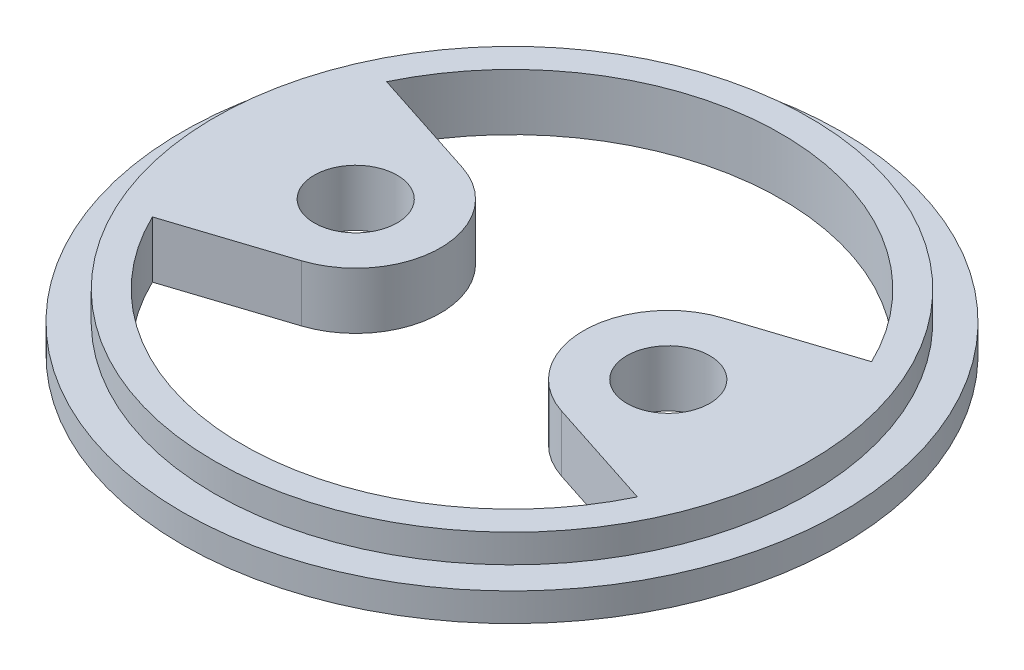
ISO-10303-21;
HEADER;
FILE_DESCRIPTION(('STEP AP214'),'2;1');
FILE_NAME('part.step','',(''),(''),'','','');
FILE_SCHEMA(('AUTOMOTIVE_DESIGN { 1 0 10303 214 1 1 1 1 }'));
ENDSEC;
DATA;
#1=APPLICATION_CONTEXT('core data for automotive mechanical design processes');
#2=APPLICATION_PROTOCOL_DEFINITION('international standard','automotive_design',2000,#1);
#3=PRODUCT_CONTEXT('',#1,'mechanical');
#4=PRODUCT('Part','Part','',(#3));
#5=PRODUCT_RELATED_PRODUCT_CATEGORY('part','',(#4));
#6=PRODUCT_DEFINITION_FORMATION('','',#4);
#7=PRODUCT_DEFINITION_CONTEXT('part definition',#1,'design');
#8=PRODUCT_DEFINITION('design','',#6,#7);
#9=PRODUCT_DEFINITION_SHAPE('','',#8);
#10=(LENGTH_UNIT() NAMED_UNIT(*) SI_UNIT(.MILLI.,.METRE.));
#11=(NAMED_UNIT(*) PLANE_ANGLE_UNIT() SI_UNIT($,.RADIAN.));
#12=(NAMED_UNIT(*) SI_UNIT($,.STERADIAN.) SOLID_ANGLE_UNIT());
#13=UNCERTAINTY_MEASURE_WITH_UNIT(LENGTH_MEASURE(1.E-05),#10,'distance_accuracy_value','');
#14=(GEOMETRIC_REPRESENTATION_CONTEXT(3) GLOBAL_UNCERTAINTY_ASSIGNED_CONTEXT((#13)) GLOBAL_UNIT_ASSIGNED_CONTEXT((#10,
#11,#12)) REPRESENTATION_CONTEXT('',''));
#15=CARTESIAN_POINT('',(0.,0.,0.));
#16=DIRECTION('',(0.,0.,1.));
#17=DIRECTION('',(1.,0.,0.));
#18=AXIS2_PLACEMENT_3D('',#15,#16,#17);
#19=CARTESIAN_POINT('',(0.,3.,0.));
#20=DIRECTION('',(0.,1.,0.));
#21=DIRECTION('',(0.,0.,1.));
#22=AXIS2_PLACEMENT_3D('',#19,#20,#21);
#23=PLANE('',#22);
#24=CARTESIAN_POINT('',(-8.3,3.,0.));
#25=DIRECTION('',(0.,1.,0.));
#26=DIRECTION('',(0.,0.,1.));
#27=AXIS2_PLACEMENT_3D('',#24,#25,#26);
#28=CIRCLE('',#27,2.2);
#29=CARTESIAN_POINT('',(-8.3,3.,2.2));
#30=VERTEX_POINT('',#29);
#31=EDGE_CURVE('E57',#30,#30,#28,.T.);
#32=ORIENTED_EDGE('',*,*,#31,.F.);
#33=EDGE_LOOP('',(#32));
#34=FACE_BOUND('',#33,.T.);
#35=CARTESIAN_POINT('',(8.3,3.,0.));
#36=DIRECTION('',(0.,-1.,0.));
#37=DIRECTION('',(0.,0.,-1.));
#38=AXIS2_PLACEMENT_3D('',#35,#36,#37);
#39=CIRCLE('',#38,2.2);
#40=CARTESIAN_POINT('',(8.3,3.,-2.2));
#41=VERTEX_POINT('',#40);
#42=EDGE_CURVE('E184',#41,#41,#39,.T.);
#43=ORIENTED_EDGE('',*,*,#42,.T.);
#44=EDGE_LOOP('',(#43));
#45=FACE_BOUND('',#44,.T.);
#46=CARTESIAN_POINT('',(0.,3.,0.));
#47=DIRECTION('',(0.,1.,0.));
#48=DIRECTION('',(0.,0.,1.));
#49=AXIS2_PLACEMENT_3D('',#46,#47,#48);
#50=CIRCLE('',#49,15.8);
#51=CARTESIAN_POINT('',(0.,3.,15.8));
#52=VERTEX_POINT('',#51);
#53=EDGE_CURVE('E167',#52,#52,#50,.T.);
#54=ORIENTED_EDGE('',*,*,#53,.T.);
#55=EDGE_LOOP('',(#54));
#56=FACE_BOUND('',#55,.T.);
#57=DIRECTION('',(0.951056516295155,0.,-0.309016994374942));
#58=VECTOR('',#57,1.);
#59=CARTESIAN_POINT('',(-0.597997001343299,3.,-1.84044552631447));
#60=LINE('',#59,#58);
#61=CARTESIAN_POINT('',(6.90942352531276,3.,-4.2797543233282));
#62=VERTEX_POINT('',#61);
#63=CARTESIAN_POINT('',(12.8770058875075,3.,-6.21873937169731));
#64=VERTEX_POINT('',#63);
#65=EDGE_CURVE('E151',#62,#64,#60,.T.);
#66=ORIENTED_EDGE('',*,*,#65,.F.);
#67=CARTESIAN_POINT('',(8.3,3.,0.));
#68=DIRECTION('',(0.,1.,0.));
#69=DIRECTION('',(0.,0.,1.));
#70=AXIS2_PLACEMENT_3D('',#67,#68,#69);
#71=CIRCLE('',#70,4.5);
#72=CARTESIAN_POINT('',(6.90942352531276,3.,4.2797543233282));
#73=VERTEX_POINT('',#72);
#74=EDGE_CURVE('E64',#62,#73,#71,.T.);
#75=ORIENTED_EDGE('',*,*,#74,.T.);
#76=DIRECTION('',(0.951056516295155,0.,0.309016994374942));
#77=VECTOR('',#76,1.);
#78=CARTESIAN_POINT('',(-0.597997001343299,3.,1.84044552631447));
#79=LINE('',#78,#77);
#80=CARTESIAN_POINT('',(12.8770058875075,3.,6.21873937169731));
#81=VERTEX_POINT('',#80);
#82=EDGE_CURVE('E133',#73,#81,#79,.T.);
#83=ORIENTED_EDGE('',*,*,#82,.T.);
#84=CARTESIAN_POINT('',(0.,3.,0.));
#85=DIRECTION('',(0.,1.,0.));
#86=DIRECTION('',(0.,0.,1.));
#87=AXIS2_PLACEMENT_3D('',#84,#85,#86);
#88=CIRCLE('',#87,14.3);
#89=CARTESIAN_POINT('',(-12.8770058875075,3.,6.21873937169731));
#90=VERTEX_POINT('',#89);
#91=EDGE_CURVE('E136',#90,#81,#88,.T.);
#92=ORIENTED_EDGE('',*,*,#91,.F.);
#93=DIRECTION('',(-0.951056516295156,0.,0.309016994374942));
#94=VECTOR('',#93,1.);
#95=CARTESIAN_POINT('',(0.597997001343298,3.,1.84044552631448));
#96=LINE('',#95,#94);
#97=CARTESIAN_POINT('',(-6.90942352531276,3.,4.2797543233282));
#98=VERTEX_POINT('',#97);
#99=EDGE_CURVE('E162',#98,#90,#96,.T.);
#100=ORIENTED_EDGE('',*,*,#99,.F.);
#101=CARTESIAN_POINT('',(-8.3,3.,0.));
#102=DIRECTION('',(0.,1.,0.));
#103=DIRECTION('',(0.,0.,1.));
#104=AXIS2_PLACEMENT_3D('',#101,#102,#103);
#105=CIRCLE('',#104,4.5);
#106=CARTESIAN_POINT('',(-6.90942352531276,3.,-4.2797543233282));
#107=VERTEX_POINT('',#106);
#108=EDGE_CURVE('E159',#107,#98,#105,.F.);
#109=ORIENTED_EDGE('',*,*,#108,.F.);
#110=DIRECTION('',(-0.951056516295156,0.,-0.309016994374942));
#111=VECTOR('',#110,1.);
#112=CARTESIAN_POINT('',(0.597997001343298,3.,-1.84044552631448));
#113=LINE('',#112,#111);
#114=CARTESIAN_POINT('',(-12.8770058875075,3.,-6.21873937169731));
#115=VERTEX_POINT('',#114);
#116=EDGE_CURVE('E156',#107,#115,#113,.T.);
#117=ORIENTED_EDGE('',*,*,#116,.T.);
#118=EDGE_CURVE('E153',#64,#115,#88,.T.);
#119=ORIENTED_EDGE('',*,*,#118,.F.);
#120=EDGE_LOOP('',(#66,#75,#83,#92,#100,#109,#117,#119));
#121=FACE_BOUND('',#120,.T.);
#122=ADVANCED_FACE('F48',(#34,#45,#56,#121),#23,.T.);
#123=CARTESIAN_POINT('',(0.,0.,0.));
#124=DIRECTION('',(0.,1.,0.));
#125=DIRECTION('',(0.,0.,1.));
#126=AXIS2_PLACEMENT_3D('',#123,#124,#125);
#127=PLANE('',#126);
#128=CARTESIAN_POINT('',(-8.3,0.,0.));
#129=DIRECTION('',(0.,1.,0.));
#130=DIRECTION('',(0.,0.,1.));
#131=AXIS2_PLACEMENT_3D('',#128,#129,#130);
#132=CIRCLE('',#131,2.2);
#133=CARTESIAN_POINT('',(-8.3,0.,2.2));
#134=VERTEX_POINT('',#133);
#135=EDGE_CURVE('E187',#134,#134,#132,.T.);
#136=ORIENTED_EDGE('',*,*,#135,.T.);
#137=EDGE_LOOP('',(#136));
#138=FACE_BOUND('',#137,.T.);
#139=CARTESIAN_POINT('',(0.,0.,0.));
#140=DIRECTION('',(0.,1.,0.));
#141=DIRECTION('',(0.,0.,1.));
#142=AXIS2_PLACEMENT_3D('',#139,#140,#141);
#143=CIRCLE('',#142,17.5);
#144=CARTESIAN_POINT('',(0.,0.,17.5));
#145=VERTEX_POINT('',#144);
#146=EDGE_CURVE('E13',#145,#145,#143,.T.);
#147=ORIENTED_EDGE('',*,*,#146,.F.);
#148=EDGE_LOOP('',(#147));
#149=FACE_BOUND('',#148,.T.);
#150=CARTESIAN_POINT('',(8.3,0.,0.));
#151=DIRECTION('',(0.,-1.,0.));
#152=DIRECTION('',(0.,0.,-1.));
#153=AXIS2_PLACEMENT_3D('',#150,#151,#152);
#154=CIRCLE('',#153,2.2);
#155=CARTESIAN_POINT('',(8.3,0.,-2.2));
#156=VERTEX_POINT('',#155);
#157=EDGE_CURVE('E188',#156,#156,#154,.T.);
#158=ORIENTED_EDGE('',*,*,#157,.F.);
#159=EDGE_LOOP('',(#158));
#160=FACE_BOUND('',#159,.T.);
#161=CARTESIAN_POINT('',(8.3,0.,0.));
#162=DIRECTION('',(0.,1.,0.));
#163=DIRECTION('',(0.,0.,1.));
#164=AXIS2_PLACEMENT_3D('',#161,#162,#163);
#165=CIRCLE('',#164,4.5);
#166=CARTESIAN_POINT('',(6.90942352531276,0.,-4.2797543233282));
#167=VERTEX_POINT('',#166);
#168=CARTESIAN_POINT('',(6.90942352531276,0.,4.2797543233282));
#169=VERTEX_POINT('',#168);
#170=EDGE_CURVE('E117',#167,#169,#165,.T.);
#171=ORIENTED_EDGE('',*,*,#170,.F.);
#172=DIRECTION('',(0.951056516295155,0.,-0.309016994374942));
#173=VECTOR('',#172,1.);
#174=CARTESIAN_POINT('',(-0.597997001343299,0.,-1.84044552631447));
#175=LINE('',#174,#173);
#176=CARTESIAN_POINT('',(12.8770058875075,0.,-6.21873937169731));
#177=VERTEX_POINT('',#176);
#178=EDGE_CURVE('E126',#167,#177,#175,.T.);
#179=ORIENTED_EDGE('',*,*,#178,.T.);
#180=CARTESIAN_POINT('',(0.,0.,0.));
#181=DIRECTION('',(0.,1.,0.));
#182=DIRECTION('',(0.,0.,1.));
#183=AXIS2_PLACEMENT_3D('',#180,#181,#182);
#184=CIRCLE('',#183,14.3);
#185=CARTESIAN_POINT('',(-12.8770058875075,0.,-6.21873937169731));
#186=VERTEX_POINT('',#185);
#187=EDGE_CURVE('E72',#177,#186,#184,.T.);
#188=ORIENTED_EDGE('',*,*,#187,.T.);
#189=DIRECTION('',(-0.951056516295156,0.,-0.309016994374942));
#190=VECTOR('',#189,1.);
#191=CARTESIAN_POINT('',(0.597997001343298,0.,-1.84044552631448));
#192=LINE('',#191,#190);
#193=CARTESIAN_POINT('',(-6.90942352531276,0.,-4.2797543233282));
#194=VERTEX_POINT('',#193);
#195=EDGE_CURVE('E140',#194,#186,#192,.T.);
#196=ORIENTED_EDGE('',*,*,#195,.F.);
#197=CARTESIAN_POINT('',(-8.3,0.,0.));
#198=DIRECTION('',(0.,1.,0.));
#199=DIRECTION('',(0.,0.,1.));
#200=AXIS2_PLACEMENT_3D('',#197,#198,#199);
#201=CIRCLE('',#200,4.5);
#202=CARTESIAN_POINT('',(-6.90942352531276,0.,4.2797543233282));
#203=VERTEX_POINT('',#202);
#204=EDGE_CURVE('E143',#194,#203,#201,.F.);
#205=ORIENTED_EDGE('',*,*,#204,.T.);
#206=DIRECTION('',(-0.951056516295156,0.,0.309016994374942));
#207=VECTOR('',#206,1.);
#208=CARTESIAN_POINT('',(0.597997001343298,0.,1.84044552631448));
#209=LINE('',#208,#207);
#210=CARTESIAN_POINT('',(-12.8770058875075,0.,6.21873937169731));
#211=VERTEX_POINT('',#210);
#212=EDGE_CURVE('E146',#203,#211,#209,.T.);
#213=ORIENTED_EDGE('',*,*,#212,.T.);
#214=CARTESIAN_POINT('',(12.8770058875075,0.,6.21873937169731));
#215=VERTEX_POINT('',#214);
#216=EDGE_CURVE('E141',#211,#215,#184,.T.);
#217=ORIENTED_EDGE('',*,*,#216,.T.);
#218=DIRECTION('',(0.951056516295155,0.,0.309016994374942));
#219=VECTOR('',#218,1.);
#220=CARTESIAN_POINT('',(-0.597997001343299,0.,1.84044552631447));
#221=LINE('',#220,#219);
#222=EDGE_CURVE('E123',#169,#215,#221,.T.);
#223=ORIENTED_EDGE('',*,*,#222,.F.);
#224=EDGE_LOOP('',(#171,#179,#188,#196,#205,#213,#217,#223));
#225=FACE_BOUND('',#224,.T.);
#226=ADVANCED_FACE('F131',(#138,#149,#160,#225),#127,.F.);
#227=CARTESIAN_POINT('',(0.,3.,0.));
#228=DIRECTION('',(0.,-1.,0.));
#229=DIRECTION('',(0.,0.,-1.));
#230=AXIS2_PLACEMENT_3D('',#227,#228,#229);
#231=CYLINDRICAL_SURFACE('',#230,17.5);
#232=ORIENTED_EDGE('',*,*,#146,.T.);
#233=EDGE_LOOP('',(#232));
#234=FACE_BOUND('',#233,.T.);
#235=CARTESIAN_POINT('',(0.,1.5,0.));
#236=DIRECTION('',(0.,1.,0.));
#237=DIRECTION('',(0.,0.,1.));
#238=AXIS2_PLACEMENT_3D('',#235,#236,#237);
#239=CIRCLE('',#238,17.5);
#240=CARTESIAN_POINT('',(0.,1.5,17.5));
#241=VERTEX_POINT('',#240);
#242=EDGE_CURVE('E52',#241,#241,#239,.T.);
#243=ORIENTED_EDGE('',*,*,#242,.F.);
#244=EDGE_LOOP('',(#243));
#245=FACE_BOUND('',#244,.T.);
#246=ADVANCED_FACE('F50',(#234,#245),#231,.T.);
#247=CARTESIAN_POINT('',(-8.3,3.,0.));
#248=DIRECTION('',(0.,-1.,0.));
#249=DIRECTION('',(0.,0.,-1.));
#250=AXIS2_PLACEMENT_3D('',#247,#248,#249);
#251=CYLINDRICAL_SURFACE('',#250,2.2);
#252=ORIENTED_EDGE('',*,*,#31,.T.);
#253=EDGE_LOOP('',(#252));
#254=FACE_BOUND('',#253,.T.);
#255=ORIENTED_EDGE('',*,*,#135,.F.);
#256=EDGE_LOOP('',(#255));
#257=FACE_BOUND('',#256,.T.);
#258=ADVANCED_FACE('F198',(#254,#257),#251,.F.);
#259=CARTESIAN_POINT('',(8.3,3.,0.));
#260=DIRECTION('',(0.,-1.,0.));
#261=DIRECTION('',(0.,0.,-1.));
#262=AXIS2_PLACEMENT_3D('',#259,#260,#261);
#263=CYLINDRICAL_SURFACE('',#262,2.2);
#264=ORIENTED_EDGE('',*,*,#42,.F.);
#265=EDGE_LOOP('',(#264));
#266=FACE_BOUND('',#265,.T.);
#267=ORIENTED_EDGE('',*,*,#157,.T.);
#268=EDGE_LOOP('',(#267));
#269=FACE_BOUND('',#268,.T.);
#270=ADVANCED_FACE('F200',(#266,#269),#263,.F.);
#271=CARTESIAN_POINT('',(0.,1.5,0.));
#272=DIRECTION('',(0.,1.,0.));
#273=DIRECTION('',(0.,0.,1.));
#274=AXIS2_PLACEMENT_3D('',#271,#272,#273);
#275=PLANE('',#274);
#276=CARTESIAN_POINT('',(0.,1.5,0.));
#277=DIRECTION('',(0.,1.,0.));
#278=DIRECTION('',(0.,0.,1.));
#279=AXIS2_PLACEMENT_3D('',#276,#277,#278);
#280=CIRCLE('',#279,15.8);
#281=CARTESIAN_POINT('',(0.,1.5,15.8));
#282=VERTEX_POINT('',#281);
#283=EDGE_CURVE('E179',#282,#282,#280,.T.);
#284=ORIENTED_EDGE('',*,*,#283,.F.);
#285=EDGE_LOOP('',(#284));
#286=FACE_BOUND('',#285,.T.);
#287=ORIENTED_EDGE('',*,*,#242,.T.);
#288=EDGE_LOOP('',(#287));
#289=FACE_BOUND('',#288,.T.);
#290=ADVANCED_FACE('F207',(#286,#289),#275,.T.);
#291=CARTESIAN_POINT('',(0.,1.5,0.));
#292=DIRECTION('',(0.,1.,0.));
#293=DIRECTION('',(0.,0.,1.));
#294=AXIS2_PLACEMENT_3D('',#291,#292,#293);
#295=CYLINDRICAL_SURFACE('',#294,15.8);
#296=ORIENTED_EDGE('',*,*,#283,.T.);
#297=EDGE_LOOP('',(#296));
#298=FACE_BOUND('',#297,.T.);
#299=ORIENTED_EDGE('',*,*,#53,.F.);
#300=EDGE_LOOP('',(#299));
#301=FACE_BOUND('',#300,.T.);
#302=ADVANCED_FACE('F252',(#298,#301),#295,.T.);
#303=CARTESIAN_POINT('',(8.3,0.,0.));
#304=DIRECTION('',(0.,1.,0.));
#305=DIRECTION('',(0.,0.,1.));
#306=AXIS2_PLACEMENT_3D('',#303,#304,#305);
#307=CYLINDRICAL_SURFACE('',#306,4.5);
#308=ORIENTED_EDGE('',*,*,#74,.F.);
#309=DIRECTION('',(0.,1.,0.));
#310=VECTOR('',#309,1.);
#311=CARTESIAN_POINT('',(6.90942352531276,0.,-4.2797543233282));
#312=LINE('',#311,#310);
#313=EDGE_CURVE('E113',#167,#62,#312,.T.);
#314=ORIENTED_EDGE('',*,*,#313,.F.);
#315=ORIENTED_EDGE('',*,*,#170,.T.);
#316=DIRECTION('',(0.,1.,0.));
#317=VECTOR('',#316,1.);
#318=CARTESIAN_POINT('',(6.90942352531276,0.,4.2797543233282));
#319=LINE('',#318,#317);
#320=EDGE_CURVE('E165',#169,#73,#319,.T.);
#321=ORIENTED_EDGE('',*,*,#320,.T.);
#322=EDGE_LOOP('',(#308,#314,#315,#321));
#323=FACE_BOUND('',#322,.T.);
#324=ADVANCED_FACE('F115',(#323),#307,.T.);
#325=CARTESIAN_POINT('',(-0.597997001343299,0.,1.84044552631447));
#326=DIRECTION('',(-0.309016994374942,0.,0.951056516295155));
#327=DIRECTION('',(0.951056516295155,0.,0.309016994374942));
#328=AXIS2_PLACEMENT_3D('',#325,#326,#327);
#329=PLANE('',#328);
#330=ORIENTED_EDGE('',*,*,#82,.F.);
#331=ORIENTED_EDGE('',*,*,#320,.F.);
#332=ORIENTED_EDGE('',*,*,#222,.T.);
#333=DIRECTION('',(0.,1.,0.));
#334=VECTOR('',#333,1.);
#335=CARTESIAN_POINT('',(12.8770058875075,0.,6.21873937169731));
#336=LINE('',#335,#334);
#337=EDGE_CURVE('E168',#215,#81,#336,.T.);
#338=ORIENTED_EDGE('',*,*,#337,.T.);
#339=EDGE_LOOP('',(#330,#331,#332,#338));
#340=FACE_BOUND('',#339,.T.);
#341=ADVANCED_FACE('F244',(#340),#329,.T.);
#342=CARTESIAN_POINT('',(0.,0.,0.));
#343=DIRECTION('',(0.,1.,0.));
#344=DIRECTION('',(0.,0.,1.));
#345=AXIS2_PLACEMENT_3D('',#342,#343,#344);
#346=CYLINDRICAL_SURFACE('',#345,14.3);
#347=ORIENTED_EDGE('',*,*,#91,.T.);
#348=ORIENTED_EDGE('',*,*,#337,.F.);
#349=ORIENTED_EDGE('',*,*,#216,.F.);
#350=DIRECTION('',(0.,1.,0.));
#351=VECTOR('',#350,1.);
#352=CARTESIAN_POINT('',(-12.8770058875075,0.,6.21873937169731));
#353=LINE('',#352,#351);
#354=EDGE_CURVE('E170',#211,#90,#353,.T.);
#355=ORIENTED_EDGE('',*,*,#354,.T.);
#356=EDGE_LOOP('',(#347,#348,#349,#355));
#357=FACE_BOUND('',#356,.T.);
#358=ADVANCED_FACE('F241',(#357),#346,.F.);
#359=CARTESIAN_POINT('',(0.597997001343298,0.,1.84044552631448));
#360=DIRECTION('',(-0.309016994374942,0.,-0.951056516295155));
#361=DIRECTION('',(-0.951056516295156,0.,0.309016994374942));
#362=AXIS2_PLACEMENT_3D('',#359,#360,#361);
#363=PLANE('',#362);
#364=ORIENTED_EDGE('',*,*,#99,.T.);
#365=ORIENTED_EDGE('',*,*,#354,.F.);
#366=ORIENTED_EDGE('',*,*,#212,.F.);
#367=DIRECTION('',(0.,1.,0.));
#368=VECTOR('',#367,1.);
#369=CARTESIAN_POINT('',(-6.90942352531276,0.,4.2797543233282));
#370=LINE('',#369,#368);
#371=EDGE_CURVE('E172',#203,#98,#370,.T.);
#372=ORIENTED_EDGE('',*,*,#371,.T.);
#373=EDGE_LOOP('',(#364,#365,#366,#372));
#374=FACE_BOUND('',#373,.T.);
#375=ADVANCED_FACE('F236',(#374),#363,.F.);
#376=CARTESIAN_POINT('',(-8.3,0.,0.));
#377=DIRECTION('',(0.,1.,0.));
#378=DIRECTION('',(0.,0.,1.));
#379=AXIS2_PLACEMENT_3D('',#376,#377,#378);
#380=CYLINDRICAL_SURFACE('',#379,4.5);
#381=ORIENTED_EDGE('',*,*,#108,.T.);
#382=ORIENTED_EDGE('',*,*,#371,.F.);
#383=ORIENTED_EDGE('',*,*,#204,.F.);
#384=DIRECTION('',(0.,1.,0.));
#385=VECTOR('',#384,1.);
#386=CARTESIAN_POINT('',(-6.90942352531276,0.,-4.2797543233282));
#387=LINE('',#386,#385);
#388=EDGE_CURVE('E174',#194,#107,#387,.T.);
#389=ORIENTED_EDGE('',*,*,#388,.T.);
#390=EDGE_LOOP('',(#381,#382,#383,#389));
#391=FACE_BOUND('',#390,.T.);
#392=ADVANCED_FACE('F232',(#391),#380,.T.);
#393=CARTESIAN_POINT('',(0.597997001343298,0.,-1.84044552631448));
#394=DIRECTION('',(0.309016994374942,0.,-0.951056516295155));
#395=DIRECTION('',(-0.951056516295156,0.,-0.309016994374942));
#396=AXIS2_PLACEMENT_3D('',#393,#394,#395);
#397=PLANE('',#396);
#398=ORIENTED_EDGE('',*,*,#116,.F.);
#399=ORIENTED_EDGE('',*,*,#388,.F.);
#400=ORIENTED_EDGE('',*,*,#195,.T.);
#401=DIRECTION('',(0.,1.,0.));
#402=VECTOR('',#401,1.);
#403=CARTESIAN_POINT('',(-12.8770058875075,0.,-6.21873937169731));
#404=LINE('',#403,#402);
#405=EDGE_CURVE('E176',#186,#115,#404,.T.);
#406=ORIENTED_EDGE('',*,*,#405,.T.);
#407=EDGE_LOOP('',(#398,#399,#400,#406));
#408=FACE_BOUND('',#407,.T.);
#409=ADVANCED_FACE('F230',(#408),#397,.T.);
#410=ORIENTED_EDGE('',*,*,#118,.T.);
#411=ORIENTED_EDGE('',*,*,#405,.F.);
#412=ORIENTED_EDGE('',*,*,#187,.F.);
#413=DIRECTION('',(0.,1.,0.));
#414=VECTOR('',#413,1.);
#415=CARTESIAN_POINT('',(12.8770058875075,0.,-6.21873937169731));
#416=LINE('',#415,#414);
#417=EDGE_CURVE('E122',#177,#64,#416,.T.);
#418=ORIENTED_EDGE('',*,*,#417,.T.);
#419=EDGE_LOOP('',(#410,#411,#412,#418));
#420=FACE_BOUND('',#419,.T.);
#421=ADVANCED_FACE('F226',(#420),#346,.F.);
#422=CARTESIAN_POINT('',(-0.597997001343299,0.,-1.84044552631447));
#423=DIRECTION('',(0.309016994374942,0.,0.951056516295155));
#424=DIRECTION('',(0.951056516295155,0.,-0.309016994374942));
#425=AXIS2_PLACEMENT_3D('',#422,#423,#424);
#426=PLANE('',#425);
#427=ORIENTED_EDGE('',*,*,#65,.T.);
#428=ORIENTED_EDGE('',*,*,#417,.F.);
#429=ORIENTED_EDGE('',*,*,#178,.F.);
#430=ORIENTED_EDGE('',*,*,#313,.T.);
#431=EDGE_LOOP('',(#427,#428,#429,#430));
#432=FACE_BOUND('',#431,.T.);
#433=ADVANCED_FACE('F127',(#432),#426,.F.);
#434=CLOSED_SHELL('',(#122,#226,#246,#258,#270,#290,#302,#324,#341,#358,#375,#392,#409,#421,#433));
#435=MANIFOLD_SOLID_BREP('B2',#434);
#436=ADVANCED_BREP_SHAPE_REPRESENTATION('',(#18,#435),#14);
#437=SHAPE_DEFINITION_REPRESENTATION(#9,#436);
ENDSEC;
END-ISO-10303-21;
